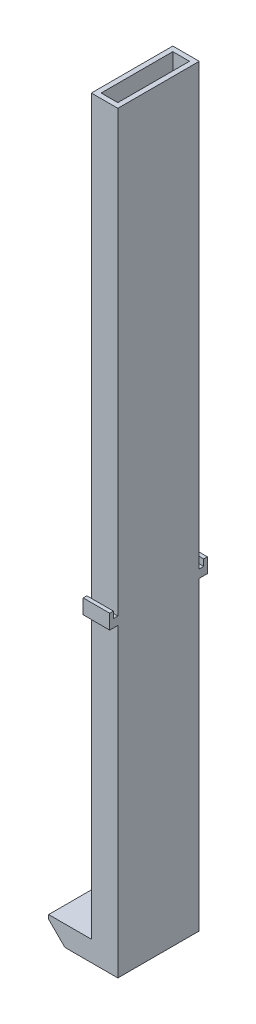
ISO-10303-21;
HEADER;
FILE_DESCRIPTION(('STEP AP214'),'2;1');
FILE_NAME('part.step','',(''),(''),'','','');
FILE_SCHEMA(('AUTOMOTIVE_DESIGN { 1 0 10303 214 1 1 1 1 }'));
ENDSEC;
DATA;
#1=APPLICATION_CONTEXT('core data for automotive mechanical design processes');
#2=APPLICATION_PROTOCOL_DEFINITION('international standard','automotive_design',2000,#1);
#3=PRODUCT_CONTEXT('',#1,'mechanical');
#4=PRODUCT('Part','Part','',(#3));
#5=PRODUCT_RELATED_PRODUCT_CATEGORY('part','',(#4));
#6=PRODUCT_DEFINITION_FORMATION('','',#4);
#7=PRODUCT_DEFINITION_CONTEXT('part definition',#1,'design');
#8=PRODUCT_DEFINITION('design','',#6,#7);
#9=PRODUCT_DEFINITION_SHAPE('','',#8);
#10=(LENGTH_UNIT() NAMED_UNIT(*) SI_UNIT(.MILLI.,.METRE.));
#11=(NAMED_UNIT(*) PLANE_ANGLE_UNIT() SI_UNIT($,.RADIAN.));
#12=(NAMED_UNIT(*) SI_UNIT($,.STERADIAN.) SOLID_ANGLE_UNIT());
#13=UNCERTAINTY_MEASURE_WITH_UNIT(LENGTH_MEASURE(1.E-05),#10,'distance_accuracy_value','');
#14=(GEOMETRIC_REPRESENTATION_CONTEXT(3) GLOBAL_UNCERTAINTY_ASSIGNED_CONTEXT((#13)) GLOBAL_UNIT_ASSIGNED_CONTEXT((#10,
#11,#12)) REPRESENTATION_CONTEXT('',''));
#15=CARTESIAN_POINT('',(0.,0.,0.));
#16=DIRECTION('',(0.,0.,1.));
#17=DIRECTION('',(1.,0.,0.));
#18=AXIS2_PLACEMENT_3D('',#15,#16,#17);
#19=CARTESIAN_POINT('',(0.,0.,0.));
#20=DIRECTION('',(0.,0.,-1.));
#21=DIRECTION('',(-1.,0.,0.));
#22=AXIS2_PLACEMENT_3D('',#19,#20,#21);
#23=PLANE('',#22);
#24=DIRECTION('',(0.,1.,0.));
#25=VECTOR('',#24,1.);
#26=CARTESIAN_POINT('',(4.25,-46.25,0.));
#27=LINE('',#26,#25);
#28=CARTESIAN_POINT('',(4.25000000000001,-7.74999999999999,0.));
#29=VERTEX_POINT('',#28);
#30=CARTESIAN_POINT('',(4.25,46.25,0.));
#31=VERTEX_POINT('',#30);
#32=EDGE_CURVE('E409',#29,#31,#27,.T.);
#33=ORIENTED_EDGE('',*,*,#32,.F.);
#34=DIRECTION('',(-1.,0.,0.));
#35=VECTOR('',#34,1.);
#36=CARTESIAN_POINT('',(4.25000000000001,-7.74999999999999,0.));
#37=LINE('',#36,#35);
#38=CARTESIAN_POINT('',(1.00000000000001,-7.74999999999999,0.));
#39=VERTEX_POINT('',#38);
#40=EDGE_CURVE('E271',#29,#39,#37,.T.);
#41=ORIENTED_EDGE('',*,*,#40,.T.);
#42=DIRECTION('',(0.,1.,0.));
#43=VECTOR('',#42,1.);
#44=CARTESIAN_POINT('',(1.00000000000001,0.,0.));
#45=LINE('',#44,#43);
#46=CARTESIAN_POINT('',(1.,46.25,0.));
#47=VERTEX_POINT('',#46);
#48=EDGE_CURVE('E427',#39,#47,#45,.T.);
#49=ORIENTED_EDGE('',*,*,#48,.T.);
#50=DIRECTION('',(1.,0.,0.));
#51=VECTOR('',#50,1.);
#52=CARTESIAN_POINT('',(-4.25,46.25,0.));
#53=LINE('',#52,#51);
#54=EDGE_CURVE('E405',#47,#31,#53,.T.);
#55=ORIENTED_EDGE('',*,*,#54,.T.);
#56=EDGE_LOOP('',(#33,#41,#49,#55));
#57=FACE_BOUND('',#56,.T.);
#58=ADVANCED_FACE('F47',(#57),#23,.T.);
#59=CARTESIAN_POINT('',(0.,0.,10.));
#60=DIRECTION('',(0.,0.,-1.));
#61=DIRECTION('',(-1.,0.,0.));
#62=AXIS2_PLACEMENT_3D('',#59,#60,#61);
#63=PLANE('',#62);
#64=DIRECTION('',(-1.,0.,0.));
#65=VECTOR('',#64,1.);
#66=CARTESIAN_POINT('',(4.25000000000001,-7.74999999999999,10.));
#67=LINE('',#66,#65);
#68=CARTESIAN_POINT('',(4.25000000000001,-7.74999999999999,10.));
#69=VERTEX_POINT('',#68);
#70=CARTESIAN_POINT('',(1.00000000000001,-7.74999999999999,10.));
#71=VERTEX_POINT('',#70);
#72=EDGE_CURVE('E346',#69,#71,#67,.T.);
#73=ORIENTED_EDGE('',*,*,#72,.F.);
#74=DIRECTION('',(0.,1.,0.));
#75=VECTOR('',#74,1.);
#76=CARTESIAN_POINT('',(4.25,-46.25,10.));
#77=LINE('',#76,#75);
#78=CARTESIAN_POINT('',(4.25,46.25,10.));
#79=VERTEX_POINT('',#78);
#80=EDGE_CURVE('E394',#69,#79,#77,.T.);
#81=ORIENTED_EDGE('',*,*,#80,.T.);
#82=DIRECTION('',(1.,0.,0.));
#83=VECTOR('',#82,1.);
#84=CARTESIAN_POINT('',(-4.25,46.25,10.));
#85=LINE('',#84,#83);
#86=CARTESIAN_POINT('',(1.,46.25,10.));
#87=VERTEX_POINT('',#86);
#88=EDGE_CURVE('E389',#87,#79,#85,.T.);
#89=ORIENTED_EDGE('',*,*,#88,.F.);
#90=DIRECTION('',(0.,-1.,0.));
#91=VECTOR('',#90,1.);
#92=CARTESIAN_POINT('',(1.,46.25,10.));
#93=LINE('',#92,#91);
#94=EDGE_CURVE('E369',#87,#71,#93,.T.);
#95=ORIENTED_EDGE('',*,*,#94,.T.);
#96=EDGE_LOOP('',(#73,#81,#89,#95));
#97=FACE_BOUND('',#96,.T.);
#98=ADVANCED_FACE('F505',(#97),#63,.F.);
#99=CARTESIAN_POINT('',(-4.25,46.25,10.));
#100=DIRECTION('',(0.,1.,0.));
#101=DIRECTION('',(0.,0.,1.));
#102=AXIS2_PLACEMENT_3D('',#99,#100,#101);
#103=PLANE('',#102);
#104=DIRECTION('',(0.,0.,-1.));
#105=VECTOR('',#104,1.);
#106=CARTESIAN_POINT('',(3.65,46.25,9.4));
#107=LINE('',#106,#105);
#108=CARTESIAN_POINT('',(3.65,46.25,9.4));
#109=VERTEX_POINT('',#108);
#110=CARTESIAN_POINT('',(3.65,46.25,0.599999999999998));
#111=VERTEX_POINT('',#110);
#112=EDGE_CURVE('E64',#109,#111,#107,.T.);
#113=ORIENTED_EDGE('',*,*,#112,.F.);
#114=DIRECTION('',(1.,0.,0.));
#115=VECTOR('',#114,1.);
#116=CARTESIAN_POINT('',(1.60000000000001,46.25,9.4));
#117=LINE('',#116,#115);
#118=CARTESIAN_POINT('',(1.60000000000001,46.25,9.4));
#119=VERTEX_POINT('',#118);
#120=EDGE_CURVE('E228',#119,#109,#117,.T.);
#121=ORIENTED_EDGE('',*,*,#120,.F.);
#122=DIRECTION('',(0.,0.,1.));
#123=VECTOR('',#122,1.);
#124=CARTESIAN_POINT('',(1.60000000000001,46.25,9.4));
#125=LINE('',#124,#123);
#126=CARTESIAN_POINT('',(1.60000000000001,46.25,0.599999999999998));
#127=VERTEX_POINT('',#126);
#128=EDGE_CURVE('E232',#127,#119,#125,.T.);
#129=ORIENTED_EDGE('',*,*,#128,.F.);
#130=DIRECTION('',(-1.,0.,0.));
#131=VECTOR('',#130,1.);
#132=CARTESIAN_POINT('',(1.60000000000001,46.25,0.599999999999998));
#133=LINE('',#132,#131);
#134=EDGE_CURVE('E241',#111,#127,#133,.T.);
#135=ORIENTED_EDGE('',*,*,#134,.F.);
#136=EDGE_LOOP('',(#113,#121,#129,#135));
#137=FACE_BOUND('',#136,.T.);
#138=ORIENTED_EDGE('',*,*,#54,.F.);
#139=DIRECTION('',(0.,0.,1.));
#140=VECTOR('',#139,1.);
#141=CARTESIAN_POINT('',(1.,46.25,-70.));
#142=LINE('',#141,#140);
#143=EDGE_CURVE('E374',#47,#87,#142,.T.);
#144=ORIENTED_EDGE('',*,*,#143,.T.);
#145=ORIENTED_EDGE('',*,*,#88,.T.);
#146=DIRECTION('',(0.,0.,-1.));
#147=VECTOR('',#146,1.);
#148=CARTESIAN_POINT('',(4.25,46.25,10.));
#149=LINE('',#148,#147);
#150=EDGE_CURVE('E402',#79,#31,#149,.T.);
#151=ORIENTED_EDGE('',*,*,#150,.T.);
#152=EDGE_LOOP('',(#138,#144,#145,#151));
#153=FACE_BOUND('',#152,.T.);
#154=ADVANCED_FACE('F482',(#137,#153),#103,.T.);
#155=CARTESIAN_POINT('',(4.25,-46.25,10.));
#156=VERTEX_POINT('',#155);
#157=CARTESIAN_POINT('',(4.25000000000001,-8.74999999999999,10.));
#158=VERTEX_POINT('',#157);
#159=EDGE_CURVE('E395',#156,#158,#77,.T.);
#160=ORIENTED_EDGE('',*,*,#159,.T.);
#161=DIRECTION('',(-1.,0.,0.));
#162=VECTOR('',#161,1.);
#163=CARTESIAN_POINT('',(4.25000000000001,-8.74999999999999,10.));
#164=LINE('',#163,#162);
#165=CARTESIAN_POINT('',(1.00000000000001,-8.74999999999998,10.));
#166=VERTEX_POINT('',#165);
#167=EDGE_CURVE('E327',#158,#166,#164,.T.);
#168=ORIENTED_EDGE('',*,*,#167,.T.);
#169=CARTESIAN_POINT('',(1.00000000000001,-43.75,10.));
#170=VERTEX_POINT('',#169);
#171=EDGE_CURVE('E368',#166,#170,#93,.T.);
#172=ORIENTED_EDGE('',*,*,#171,.T.);
#173=DIRECTION('',(1.,0.,0.));
#174=VECTOR('',#173,1.);
#175=CARTESIAN_POINT('',(-4.24999999999999,-43.75,10.));
#176=LINE('',#175,#174);
#177=CARTESIAN_POINT('',(-4.24999999999999,-43.75,10.));
#178=VERTEX_POINT('',#177);
#179=EDGE_CURVE('E349',#178,#170,#176,.T.);
#180=ORIENTED_EDGE('',*,*,#179,.F.);
#181=DIRECTION('',(0.,1.,0.));
#182=VECTOR('',#181,1.);
#183=CARTESIAN_POINT('',(-4.25,-46.25,10.));
#184=LINE('',#183,#182);
#185=CARTESIAN_POINT('',(-4.25,-44.25,10.));
#186=VERTEX_POINT('',#185);
#187=EDGE_CURVE('E386',#186,#178,#184,.T.);
#188=ORIENTED_EDGE('',*,*,#187,.F.);
#189=DIRECTION('',(0.707106781186545,-0.70710678118655,0.));
#190=VECTOR('',#189,1.);
#191=CARTESIAN_POINT('',(-2.24999999999998,-46.25,10.));
#192=LINE('',#191,#190);
#193=CARTESIAN_POINT('',(-2.24999999999998,-46.25,10.));
#194=VERTEX_POINT('',#193);
#195=EDGE_CURVE('E11',#186,#194,#192,.T.);
#196=ORIENTED_EDGE('',*,*,#195,.T.);
#197=DIRECTION('',(1.,0.,0.));
#198=VECTOR('',#197,1.);
#199=CARTESIAN_POINT('',(-4.25,-46.25,10.));
#200=LINE('',#199,#198);
#201=EDGE_CURVE('E399',#194,#156,#200,.T.);
#202=ORIENTED_EDGE('',*,*,#201,.T.);
#203=EDGE_LOOP('',(#160,#168,#172,#180,#188,#196,#202));
#204=FACE_BOUND('',#203,.T.);
#205=ADVANCED_FACE('F449',(#204),#63,.F.);
#206=DIRECTION('',(-1.,0.,0.));
#207=VECTOR('',#206,1.);
#208=CARTESIAN_POINT('',(4.25000000000001,-8.74999999999999,0.));
#209=LINE('',#208,#207);
#210=CARTESIAN_POINT('',(4.25000000000001,-8.74999999999999,0.));
#211=VERTEX_POINT('',#210);
#212=CARTESIAN_POINT('',(1.00000000000001,-8.74999999999999,0.));
#213=VERTEX_POINT('',#212);
#214=EDGE_CURVE('E285',#211,#213,#209,.T.);
#215=ORIENTED_EDGE('',*,*,#214,.F.);
#216=CARTESIAN_POINT('',(4.25,-46.25,0.));
#217=VERTEX_POINT('',#216);
#218=EDGE_CURVE('E410',#217,#211,#27,.T.);
#219=ORIENTED_EDGE('',*,*,#218,.F.);
#220=DIRECTION('',(1.,0.,0.));
#221=VECTOR('',#220,1.);
#222=CARTESIAN_POINT('',(-4.25,-46.25,0.));
#223=LINE('',#222,#221);
#224=CARTESIAN_POINT('',(-2.24999999999998,-46.25,0.));
#225=VERTEX_POINT('',#224);
#226=EDGE_CURVE('E390',#225,#217,#223,.T.);
#227=ORIENTED_EDGE('',*,*,#226,.F.);
#228=DIRECTION('',(-0.707106781186545,0.70710678118655,0.));
#229=VECTOR('',#228,1.);
#230=CARTESIAN_POINT('',(-24.25,-24.2499999999998,0.));
#231=LINE('',#230,#229);
#232=CARTESIAN_POINT('',(-4.25,-44.25,0.));
#233=VERTEX_POINT('',#232);
#234=EDGE_CURVE('E436',#225,#233,#231,.T.);
#235=ORIENTED_EDGE('',*,*,#234,.T.);
#236=DIRECTION('',(0.,1.,0.));
#237=VECTOR('',#236,1.);
#238=CARTESIAN_POINT('',(-4.25,-46.25,0.));
#239=LINE('',#238,#237);
#240=CARTESIAN_POINT('',(-4.24999999999999,-43.75,0.));
#241=VERTEX_POINT('',#240);
#242=EDGE_CURVE('E378',#233,#241,#239,.T.);
#243=ORIENTED_EDGE('',*,*,#242,.T.);
#244=DIRECTION('',(-1.,0.,0.));
#245=VECTOR('',#244,1.);
#246=CARTESIAN_POINT('',(0.,-43.75,0.));
#247=LINE('',#246,#245);
#248=CARTESIAN_POINT('',(1.00000000000001,-43.75,0.));
#249=VERTEX_POINT('',#248);
#250=EDGE_CURVE('E420',#249,#241,#247,.T.);
#251=ORIENTED_EDGE('',*,*,#250,.F.);
#252=EDGE_CURVE('E428',#249,#213,#45,.T.);
#253=ORIENTED_EDGE('',*,*,#252,.T.);
#254=EDGE_LOOP('',(#215,#219,#227,#235,#243,#251,#253));
#255=FACE_BOUND('',#254,.T.);
#256=ADVANCED_FACE('F459',(#255),#23,.T.);
#257=CARTESIAN_POINT('',(-4.25,-46.25,10.));
#258=DIRECTION('',(-1.,0.,0.));
#259=DIRECTION('',(0.,0.,1.));
#260=AXIS2_PLACEMENT_3D('',#257,#258,#259);
#261=PLANE('',#260);
#262=ORIENTED_EDGE('',*,*,#242,.F.);
#263=DIRECTION('',(0.,0.,1.));
#264=VECTOR('',#263,1.);
#265=CARTESIAN_POINT('',(-4.25,-44.25,10.));
#266=LINE('',#265,#264);
#267=EDGE_CURVE('E57',#233,#186,#266,.T.);
#268=ORIENTED_EDGE('',*,*,#267,.T.);
#269=ORIENTED_EDGE('',*,*,#187,.T.);
#270=DIRECTION('',(0.,0.,1.));
#271=VECTOR('',#270,1.);
#272=CARTESIAN_POINT('',(-4.24999999999999,-43.75,-70.));
#273=LINE('',#272,#271);
#274=EDGE_CURVE('E373',#241,#178,#273,.T.);
#275=ORIENTED_EDGE('',*,*,#274,.F.);
#276=EDGE_LOOP('',(#262,#268,#269,#275));
#277=FACE_BOUND('',#276,.T.);
#278=ADVANCED_FACE('F443',(#277),#261,.T.);
#279=CARTESIAN_POINT('',(-4.25,-46.25,10.));
#280=DIRECTION('',(0.,1.,0.));
#281=DIRECTION('',(0.,0.,1.));
#282=AXIS2_PLACEMENT_3D('',#279,#280,#281);
#283=PLANE('',#282);
#284=ORIENTED_EDGE('',*,*,#201,.F.);
#285=DIRECTION('',(0.,0.,-1.));
#286=VECTOR('',#285,1.);
#287=CARTESIAN_POINT('',(-2.24999999999998,-46.25,0.));
#288=LINE('',#287,#286);
#289=EDGE_CURVE('E432',#194,#225,#288,.T.);
#290=ORIENTED_EDGE('',*,*,#289,.T.);
#291=ORIENTED_EDGE('',*,*,#226,.T.);
#292=DIRECTION('',(0.,0.,-1.));
#293=VECTOR('',#292,1.);
#294=CARTESIAN_POINT('',(4.25,-46.25,10.));
#295=LINE('',#294,#293);
#296=EDGE_CURVE('E416',#156,#217,#295,.T.);
#297=ORIENTED_EDGE('',*,*,#296,.F.);
#298=EDGE_LOOP('',(#284,#290,#291,#297));
#299=FACE_BOUND('',#298,.T.);
#300=ADVANCED_FACE('F454',(#299),#283,.F.);
#301=CARTESIAN_POINT('',(4.25,-46.25,10.));
#302=DIRECTION('',(-1.,0.,0.));
#303=DIRECTION('',(0.,0.,1.));
#304=AXIS2_PLACEMENT_3D('',#301,#302,#303);
#305=PLANE('',#304);
#306=ORIENTED_EDGE('',*,*,#218,.T.);
#307=DIRECTION('',(0.,0.,-1.));
#308=VECTOR('',#307,1.);
#309=CARTESIAN_POINT('',(4.25000000000001,-8.74999999999999,0.));
#310=LINE('',#309,#308);
#311=CARTESIAN_POINT('',(4.25000000000001,-8.74999999999999,-1.00000000000001));
#312=VERTEX_POINT('',#311);
#313=EDGE_CURVE('E268',#211,#312,#310,.T.);
#314=ORIENTED_EDGE('',*,*,#313,.T.);
#315=DIRECTION('',(0.,1.,0.));
#316=VECTOR('',#315,1.);
#317=CARTESIAN_POINT('',(4.25000000000001,-8.74999999999999,-1.00000000000001));
#318=LINE('',#317,#316);
#319=CARTESIAN_POINT('',(4.25000000000001,-6.94999999999999,-1.00000000000001));
#320=VERTEX_POINT('',#319);
#321=EDGE_CURVE('E265',#312,#320,#318,.T.);
#322=ORIENTED_EDGE('',*,*,#321,.T.);
#323=DIRECTION('',(0.,0.,1.));
#324=VECTOR('',#323,1.);
#325=CARTESIAN_POINT('',(4.25000000000001,-6.94999999999999,-1.00000000000001));
#326=LINE('',#325,#324);
#327=CARTESIAN_POINT('',(4.25000000000001,-6.94999999999999,-0.550000000000005));
#328=VERTEX_POINT('',#327);
#329=EDGE_CURVE('E262',#320,#328,#326,.T.);
#330=ORIENTED_EDGE('',*,*,#329,.T.);
#331=DIRECTION('',(0.,-1.,0.));
#332=VECTOR('',#331,1.);
#333=CARTESIAN_POINT('',(4.25000000000001,-6.94999999999999,-0.550000000000005));
#334=LINE('',#333,#332);
#335=CARTESIAN_POINT('',(4.25000000000001,-7.74999999999999,-0.550000000000005));
#336=VERTEX_POINT('',#335);
#337=EDGE_CURVE('E258',#328,#336,#334,.T.);
#338=ORIENTED_EDGE('',*,*,#337,.T.);
#339=DIRECTION('',(0.,0.,1.));
#340=VECTOR('',#339,1.);
#341=CARTESIAN_POINT('',(4.25000000000001,-7.74999999999999,-0.550000000000005));
#342=LINE('',#341,#340);
#343=EDGE_CURVE('E255',#336,#29,#342,.T.);
#344=ORIENTED_EDGE('',*,*,#343,.T.);
#345=ORIENTED_EDGE('',*,*,#32,.T.);
#346=ORIENTED_EDGE('',*,*,#150,.F.);
#347=ORIENTED_EDGE('',*,*,#80,.F.);
#348=DIRECTION('',(0.,0.,-1.));
#349=VECTOR('',#348,1.);
#350=CARTESIAN_POINT('',(4.25000000000001,-7.74999999999999,10.55));
#351=LINE('',#350,#349);
#352=CARTESIAN_POINT('',(4.25000000000001,-7.74999999999999,10.55));
#353=VERTEX_POINT('',#352);
#354=EDGE_CURVE('E324',#353,#69,#351,.T.);
#355=ORIENTED_EDGE('',*,*,#354,.F.);
#356=DIRECTION('',(0.,-1.,0.));
#357=VECTOR('',#356,1.);
#358=CARTESIAN_POINT('',(4.25000000000001,-6.94999999999999,10.55));
#359=LINE('',#358,#357);
#360=CARTESIAN_POINT('',(4.25000000000001,-6.94999999999999,10.55));
#361=VERTEX_POINT('',#360);
#362=EDGE_CURVE('E320',#361,#353,#359,.T.);
#363=ORIENTED_EDGE('',*,*,#362,.F.);
#364=DIRECTION('',(0.,0.,-1.));
#365=VECTOR('',#364,1.);
#366=CARTESIAN_POINT('',(4.25000000000001,-6.94999999999999,11.));
#367=LINE('',#366,#365);
#368=CARTESIAN_POINT('',(4.25000000000001,-6.94999999999999,11.));
#369=VERTEX_POINT('',#368);
#370=EDGE_CURVE('E316',#369,#361,#367,.T.);
#371=ORIENTED_EDGE('',*,*,#370,.F.);
#372=DIRECTION('',(0.,1.,0.));
#373=VECTOR('',#372,1.);
#374=CARTESIAN_POINT('',(4.25000000000001,-8.74999999999999,11.));
#375=LINE('',#374,#373);
#376=CARTESIAN_POINT('',(4.25000000000001,-8.74999999999999,11.));
#377=VERTEX_POINT('',#376);
#378=EDGE_CURVE('E311',#377,#369,#375,.T.);
#379=ORIENTED_EDGE('',*,*,#378,.F.);
#380=DIRECTION('',(0.,0.,1.));
#381=VECTOR('',#380,1.);
#382=CARTESIAN_POINT('',(4.25000000000001,-8.74999999999999,10.));
#383=LINE('',#382,#381);
#384=EDGE_CURVE('E307',#158,#377,#383,.T.);
#385=ORIENTED_EDGE('',*,*,#384,.F.);
#386=ORIENTED_EDGE('',*,*,#159,.F.);
#387=ORIENTED_EDGE('',*,*,#296,.T.);
#388=EDGE_LOOP('',(#306,#314,#322,#330,#338,#344,#345,#346,#347,#355,#363,#371,#379,#385,#386,#387));
#389=FACE_BOUND('',#388,.T.);
#390=ADVANCED_FACE('F461',(#389),#305,.F.);
#391=CARTESIAN_POINT('',(1.,46.25,-70.));
#392=DIRECTION('',(-1.,0.,0.));
#393=DIRECTION('',(0.,-1.,0.));
#394=AXIS2_PLACEMENT_3D('',#391,#392,#393);
#395=PLANE('',#394);
#396=DIRECTION('',(0.,0.,1.));
#397=VECTOR('',#396,1.);
#398=CARTESIAN_POINT('',(1.00000000000001,-43.75,-70.));
#399=LINE('',#398,#397);
#400=EDGE_CURVE('E379',#249,#170,#399,.T.);
#401=ORIENTED_EDGE('',*,*,#400,.T.);
#402=ORIENTED_EDGE('',*,*,#171,.F.);
#403=DIRECTION('',(0.,0.,1.));
#404=VECTOR('',#403,1.);
#405=CARTESIAN_POINT('',(1.00000000000001,-8.74999999999999,10.));
#406=LINE('',#405,#404);
#407=CARTESIAN_POINT('',(1.00000000000001,-8.74999999999999,11.));
#408=VERTEX_POINT('',#407);
#409=EDGE_CURVE('E289',#166,#408,#406,.T.);
#410=ORIENTED_EDGE('',*,*,#409,.T.);
#411=DIRECTION('',(0.,1.,0.));
#412=VECTOR('',#411,1.);
#413=CARTESIAN_POINT('',(1.00000000000001,-8.74999999999999,11.));
#414=LINE('',#413,#412);
#415=CARTESIAN_POINT('',(1.00000000000001,-6.94999999999999,11.));
#416=VERTEX_POINT('',#415);
#417=EDGE_CURVE('E331',#408,#416,#414,.T.);
#418=ORIENTED_EDGE('',*,*,#417,.T.);
#419=DIRECTION('',(0.,0.,-1.));
#420=VECTOR('',#419,1.);
#421=CARTESIAN_POINT('',(1.00000000000001,-6.94999999999999,11.));
#422=LINE('',#421,#420);
#423=CARTESIAN_POINT('',(1.00000000000001,-6.94999999999999,10.55));
#424=VERTEX_POINT('',#423);
#425=EDGE_CURVE('E335',#416,#424,#422,.T.);
#426=ORIENTED_EDGE('',*,*,#425,.T.);
#427=DIRECTION('',(0.,-1.,0.));
#428=VECTOR('',#427,1.);
#429=CARTESIAN_POINT('',(1.00000000000001,-6.94999999999999,10.55));
#430=LINE('',#429,#428);
#431=CARTESIAN_POINT('',(1.00000000000001,-7.74999999999999,10.55));
#432=VERTEX_POINT('',#431);
#433=EDGE_CURVE('E339',#424,#432,#430,.T.);
#434=ORIENTED_EDGE('',*,*,#433,.T.);
#435=DIRECTION('',(0.,0.,-1.));
#436=VECTOR('',#435,1.);
#437=CARTESIAN_POINT('',(1.00000000000001,-7.74999999999999,10.55));
#438=LINE('',#437,#436);
#439=EDGE_CURVE('E312',#432,#71,#438,.T.);
#440=ORIENTED_EDGE('',*,*,#439,.T.);
#441=ORIENTED_EDGE('',*,*,#94,.F.);
#442=ORIENTED_EDGE('',*,*,#143,.F.);
#443=ORIENTED_EDGE('',*,*,#48,.F.);
#444=DIRECTION('',(0.,0.,1.));
#445=VECTOR('',#444,1.);
#446=CARTESIAN_POINT('',(1.00000000000001,-7.74999999999999,-0.550000000000005));
#447=LINE('',#446,#445);
#448=CARTESIAN_POINT('',(1.00000000000001,-7.74999999999999,-0.550000000000005));
#449=VERTEX_POINT('',#448);
#450=EDGE_CURVE('E72',#449,#39,#447,.T.);
#451=ORIENTED_EDGE('',*,*,#450,.F.);
#452=DIRECTION('',(0.,-1.,0.));
#453=VECTOR('',#452,1.);
#454=CARTESIAN_POINT('',(1.00000000000001,-6.94999999999999,-0.550000000000005));
#455=LINE('',#454,#453);
#456=CARTESIAN_POINT('',(1.00000000000001,-6.94999999999999,-0.550000000000005));
#457=VERTEX_POINT('',#456);
#458=EDGE_CURVE('E274',#457,#449,#455,.T.);
#459=ORIENTED_EDGE('',*,*,#458,.F.);
#460=DIRECTION('',(0.,0.,1.));
#461=VECTOR('',#460,1.);
#462=CARTESIAN_POINT('',(1.00000000000001,-6.94999999999999,-1.00000000000001));
#463=LINE('',#462,#461);
#464=CARTESIAN_POINT('',(1.00000000000001,-6.94999999999999,-1.00000000000001));
#465=VERTEX_POINT('',#464);
#466=EDGE_CURVE('E277',#465,#457,#463,.T.);
#467=ORIENTED_EDGE('',*,*,#466,.F.);
#468=DIRECTION('',(0.,1.,0.));
#469=VECTOR('',#468,1.);
#470=CARTESIAN_POINT('',(1.00000000000001,-8.74999999999999,-1.00000000000001));
#471=LINE('',#470,#469);
#472=CARTESIAN_POINT('',(1.00000000000001,-8.74999999999999,-1.00000000000001));
#473=VERTEX_POINT('',#472);
#474=EDGE_CURVE('E280',#473,#465,#471,.T.);
#475=ORIENTED_EDGE('',*,*,#474,.F.);
#476=DIRECTION('',(0.,0.,-1.));
#477=VECTOR('',#476,1.);
#478=CARTESIAN_POINT('',(1.00000000000001,-8.74999999999999,0.));
#479=LINE('',#478,#477);
#480=EDGE_CURVE('E259',#213,#473,#479,.T.);
#481=ORIENTED_EDGE('',*,*,#480,.F.);
#482=ORIENTED_EDGE('',*,*,#252,.F.);
#483=EDGE_LOOP('',(#401,#402,#410,#418,#426,#434,#440,#441,#442,#443,#451,#459,#467,#475,#481,#482));
#484=FACE_BOUND('',#483,.T.);
#485=ADVANCED_FACE('F469',(#484),#395,.T.);
#486=CARTESIAN_POINT('',(-4.24999999999999,-43.75,-70.));
#487=DIRECTION('',(0.,-1.,0.));
#488=DIRECTION('',(0.,0.,-1.));
#489=AXIS2_PLACEMENT_3D('',#486,#487,#488);
#490=PLANE('',#489);
#491=ORIENTED_EDGE('',*,*,#250,.T.);
#492=ORIENTED_EDGE('',*,*,#274,.T.);
#493=ORIENTED_EDGE('',*,*,#179,.T.);
#494=ORIENTED_EDGE('',*,*,#400,.F.);
#495=EDGE_LOOP('',(#491,#492,#493,#494));
#496=FACE_BOUND('',#495,.T.);
#497=ADVANCED_FACE('F526',(#496),#490,.F.);
#498=CARTESIAN_POINT('',(-2.24999999999998,-46.25,10.));
#499=DIRECTION('',(-0.70710678118655,-0.707106781186545,0.));
#500=DIRECTION('',(0.,0.,1.));
#501=AXIS2_PLACEMENT_3D('',#498,#499,#500);
#502=PLANE('',#501);
#503=ORIENTED_EDGE('',*,*,#195,.F.);
#504=ORIENTED_EDGE('',*,*,#267,.F.);
#505=ORIENTED_EDGE('',*,*,#234,.F.);
#506=ORIENTED_EDGE('',*,*,#289,.F.);
#507=EDGE_LOOP('',(#503,#504,#505,#506));
#508=FACE_BOUND('',#507,.T.);
#509=ADVANCED_FACE('F50',(#508),#502,.T.);
#510=CARTESIAN_POINT('',(4.25000000000001,-7.74999999999999,10.55));
#511=DIRECTION('',(0.,1.,0.));
#512=DIRECTION('',(0.,0.,1.));
#513=AXIS2_PLACEMENT_3D('',#510,#511,#512);
#514=PLANE('',#513);
#515=ORIENTED_EDGE('',*,*,#439,.F.);
#516=DIRECTION('',(-1.,0.,0.));
#517=VECTOR('',#516,1.);
#518=CARTESIAN_POINT('',(4.25000000000001,-7.74999999999999,10.55));
#519=LINE('',#518,#517);
#520=EDGE_CURVE('E350',#353,#432,#519,.T.);
#521=ORIENTED_EDGE('',*,*,#520,.F.);
#522=ORIENTED_EDGE('',*,*,#354,.T.);
#523=ORIENTED_EDGE('',*,*,#72,.T.);
#524=EDGE_LOOP('',(#515,#521,#522,#523));
#525=FACE_BOUND('',#524,.T.);
#526=ADVANCED_FACE('F545',(#525),#514,.T.);
#527=CARTESIAN_POINT('',(4.25000000000001,-6.94999999999999,10.55));
#528=DIRECTION('',(0.,0.,-1.));
#529=DIRECTION('',(-1.,0.,0.));
#530=AXIS2_PLACEMENT_3D('',#527,#528,#529);
#531=PLANE('',#530);
#532=ORIENTED_EDGE('',*,*,#433,.F.);
#533=DIRECTION('',(-1.,0.,0.));
#534=VECTOR('',#533,1.);
#535=CARTESIAN_POINT('',(4.25000000000001,-6.94999999999999,10.55));
#536=LINE('',#535,#534);
#537=EDGE_CURVE('E353',#361,#424,#536,.T.);
#538=ORIENTED_EDGE('',*,*,#537,.F.);
#539=ORIENTED_EDGE('',*,*,#362,.T.);
#540=ORIENTED_EDGE('',*,*,#520,.T.);
#541=EDGE_LOOP('',(#532,#538,#539,#540));
#542=FACE_BOUND('',#541,.T.);
#543=ADVANCED_FACE('F542',(#542),#531,.T.);
#544=CARTESIAN_POINT('',(4.25000000000001,-6.94999999999999,11.));
#545=DIRECTION('',(0.,1.,0.));
#546=DIRECTION('',(-1.,0.,0.));
#547=AXIS2_PLACEMENT_3D('',#544,#545,#546);
#548=PLANE('',#547);
#549=ORIENTED_EDGE('',*,*,#425,.F.);
#550=DIRECTION('',(-1.,0.,0.));
#551=VECTOR('',#550,1.);
#552=CARTESIAN_POINT('',(4.25000000000001,-6.94999999999999,11.));
#553=LINE('',#552,#551);
#554=EDGE_CURVE('E356',#369,#416,#553,.T.);
#555=ORIENTED_EDGE('',*,*,#554,.F.);
#556=ORIENTED_EDGE('',*,*,#370,.T.);
#557=ORIENTED_EDGE('',*,*,#537,.T.);
#558=EDGE_LOOP('',(#549,#555,#556,#557));
#559=FACE_BOUND('',#558,.T.);
#560=ADVANCED_FACE('F538',(#559),#548,.T.);
#561=CARTESIAN_POINT('',(4.25000000000001,-8.74999999999999,11.));
#562=DIRECTION('',(0.,0.,1.));
#563=DIRECTION('',(1.,0.,0.));
#564=AXIS2_PLACEMENT_3D('',#561,#562,#563);
#565=PLANE('',#564);
#566=ORIENTED_EDGE('',*,*,#417,.F.);
#567=DIRECTION('',(-1.,0.,0.));
#568=VECTOR('',#567,1.);
#569=CARTESIAN_POINT('',(4.25000000000001,-8.74999999999999,11.));
#570=LINE('',#569,#568);
#571=EDGE_CURVE('E359',#377,#408,#570,.T.);
#572=ORIENTED_EDGE('',*,*,#571,.F.);
#573=ORIENTED_EDGE('',*,*,#378,.T.);
#574=ORIENTED_EDGE('',*,*,#554,.T.);
#575=EDGE_LOOP('',(#566,#572,#573,#574));
#576=FACE_BOUND('',#575,.T.);
#577=ADVANCED_FACE('F535',(#576),#565,.T.);
#578=CARTESIAN_POINT('',(4.25000000000001,-8.74999999999999,10.));
#579=DIRECTION('',(0.,-1.,0.));
#580=DIRECTION('',(1.,0.,0.));
#581=AXIS2_PLACEMENT_3D('',#578,#579,#580);
#582=PLANE('',#581);
#583=ORIENTED_EDGE('',*,*,#409,.F.);
#584=ORIENTED_EDGE('',*,*,#167,.F.);
#585=ORIENTED_EDGE('',*,*,#384,.T.);
#586=ORIENTED_EDGE('',*,*,#571,.T.);
#587=EDGE_LOOP('',(#583,#584,#585,#586));
#588=FACE_BOUND('',#587,.T.);
#589=ADVANCED_FACE('F532',(#588),#582,.T.);
#590=CARTESIAN_POINT('',(4.25000000000001,-8.74999999999999,0.));
#591=DIRECTION('',(0.,1.,0.));
#592=DIRECTION('',(-1.,0.,0.));
#593=AXIS2_PLACEMENT_3D('',#590,#591,#592);
#594=PLANE('',#593);
#595=ORIENTED_EDGE('',*,*,#480,.T.);
#596=DIRECTION('',(-1.,0.,0.));
#597=VECTOR('',#596,1.);
#598=CARTESIAN_POINT('',(4.25000000000001,-8.74999999999999,-1.00000000000001));
#599=LINE('',#598,#597);
#600=EDGE_CURVE('E290',#312,#473,#599,.T.);
#601=ORIENTED_EDGE('',*,*,#600,.F.);
#602=ORIENTED_EDGE('',*,*,#313,.F.);
#603=ORIENTED_EDGE('',*,*,#214,.T.);
#604=EDGE_LOOP('',(#595,#601,#602,#603));
#605=FACE_BOUND('',#604,.T.);
#606=ADVANCED_FACE('F534',(#605),#594,.F.);
#607=CARTESIAN_POINT('',(4.25000000000001,-8.74999999999999,-1.00000000000001));
#608=DIRECTION('',(0.,0.,1.));
#609=DIRECTION('',(1.,0.,0.));
#610=AXIS2_PLACEMENT_3D('',#607,#608,#609);
#611=PLANE('',#610);
#612=ORIENTED_EDGE('',*,*,#474,.T.);
#613=DIRECTION('',(-1.,0.,0.));
#614=VECTOR('',#613,1.);
#615=CARTESIAN_POINT('',(4.25000000000001,-6.94999999999999,-1.00000000000001));
#616=LINE('',#615,#614);
#617=EDGE_CURVE('E294',#320,#465,#616,.T.);
#618=ORIENTED_EDGE('',*,*,#617,.F.);
#619=ORIENTED_EDGE('',*,*,#321,.F.);
#620=ORIENTED_EDGE('',*,*,#600,.T.);
#621=EDGE_LOOP('',(#612,#618,#619,#620));
#622=FACE_BOUND('',#621,.T.);
#623=ADVANCED_FACE('F611',(#622),#611,.F.);
#624=CARTESIAN_POINT('',(4.25000000000001,-6.94999999999999,-1.00000000000001));
#625=DIRECTION('',(0.,-1.,0.));
#626=DIRECTION('',(1.,0.,0.));
#627=AXIS2_PLACEMENT_3D('',#624,#625,#626);
#628=PLANE('',#627);
#629=ORIENTED_EDGE('',*,*,#466,.T.);
#630=DIRECTION('',(-1.,0.,0.));
#631=VECTOR('',#630,1.);
#632=CARTESIAN_POINT('',(4.25000000000001,-6.94999999999999,-0.550000000000005));
#633=LINE('',#632,#631);
#634=EDGE_CURVE('E298',#328,#457,#633,.T.);
#635=ORIENTED_EDGE('',*,*,#634,.F.);
#636=ORIENTED_EDGE('',*,*,#329,.F.);
#637=ORIENTED_EDGE('',*,*,#617,.T.);
#638=EDGE_LOOP('',(#629,#635,#636,#637));
#639=FACE_BOUND('',#638,.T.);
#640=ADVANCED_FACE('F500',(#639),#628,.F.);
#641=CARTESIAN_POINT('',(4.25000000000001,-6.94999999999999,-0.550000000000005));
#642=DIRECTION('',(0.,0.,-1.));
#643=DIRECTION('',(-1.,0.,0.));
#644=AXIS2_PLACEMENT_3D('',#641,#642,#643);
#645=PLANE('',#644);
#646=ORIENTED_EDGE('',*,*,#458,.T.);
#647=DIRECTION('',(-1.,0.,0.));
#648=VECTOR('',#647,1.);
#649=CARTESIAN_POINT('',(4.25000000000001,-7.74999999999999,-0.550000000000005));
#650=LINE('',#649,#648);
#651=EDGE_CURVE('E302',#336,#449,#650,.T.);
#652=ORIENTED_EDGE('',*,*,#651,.F.);
#653=ORIENTED_EDGE('',*,*,#337,.F.);
#654=ORIENTED_EDGE('',*,*,#634,.T.);
#655=EDGE_LOOP('',(#646,#652,#653,#654));
#656=FACE_BOUND('',#655,.T.);
#657=ADVANCED_FACE('F491',(#656),#645,.F.);
#658=CARTESIAN_POINT('',(4.25000000000001,-7.74999999999999,-0.550000000000005));
#659=DIRECTION('',(0.,-1.,0.));
#660=DIRECTION('',(0.,0.,-1.));
#661=AXIS2_PLACEMENT_3D('',#658,#659,#660);
#662=PLANE('',#661);
#663=ORIENTED_EDGE('',*,*,#450,.T.);
#664=ORIENTED_EDGE('',*,*,#40,.F.);
#665=ORIENTED_EDGE('',*,*,#343,.F.);
#666=ORIENTED_EDGE('',*,*,#651,.T.);
#667=EDGE_LOOP('',(#663,#664,#665,#666));
#668=FACE_BOUND('',#667,.T.);
#669=ADVANCED_FACE('F489',(#668),#662,.F.);
#670=CARTESIAN_POINT('',(3.65,-33.75,9.4));
#671=DIRECTION('',(1.,0.,0.));
#672=DIRECTION('',(0.,0.,-1.));
#673=AXIS2_PLACEMENT_3D('',#670,#671,#672);
#674=PLANE('',#673);
#675=ORIENTED_EDGE('',*,*,#112,.T.);
#676=DIRECTION('',(0.,1.,0.));
#677=VECTOR('',#676,1.);
#678=CARTESIAN_POINT('',(3.65,-33.75,0.599999999999998));
#679=LINE('',#678,#677);
#680=CARTESIAN_POINT('',(3.65,-33.75,0.599999999999998));
#681=VERTEX_POINT('',#680);
#682=EDGE_CURVE('E203',#681,#111,#679,.T.);
#683=ORIENTED_EDGE('',*,*,#682,.F.);
#684=DIRECTION('',(0.,0.,-1.));
#685=VECTOR('',#684,1.);
#686=CARTESIAN_POINT('',(3.65,-33.75,9.4));
#687=LINE('',#686,#685);
#688=CARTESIAN_POINT('',(3.65,-33.75,9.4));
#689=VERTEX_POINT('',#688);
#690=EDGE_CURVE('E207',#689,#681,#687,.T.);
#691=ORIENTED_EDGE('',*,*,#690,.F.);
#692=DIRECTION('',(0.,1.,0.));
#693=VECTOR('',#692,1.);
#694=CARTESIAN_POINT('',(3.65,-33.75,9.4));
#695=LINE('',#694,#693);
#696=EDGE_CURVE('E247',#689,#109,#695,.T.);
#697=ORIENTED_EDGE('',*,*,#696,.T.);
#698=EDGE_LOOP('',(#675,#683,#691,#697));
#699=FACE_BOUND('',#698,.T.);
#700=ADVANCED_FACE('F205',(#699),#674,.F.);
#701=CARTESIAN_POINT('',(1.60000000000001,-33.75,9.4));
#702=DIRECTION('',(0.,0.,1.));
#703=DIRECTION('',(1.,0.,0.));
#704=AXIS2_PLACEMENT_3D('',#701,#702,#703);
#705=PLANE('',#704);
#706=ORIENTED_EDGE('',*,*,#120,.T.);
#707=ORIENTED_EDGE('',*,*,#696,.F.);
#708=DIRECTION('',(1.,0.,0.));
#709=VECTOR('',#708,1.);
#710=CARTESIAN_POINT('',(1.60000000000001,-33.75,9.4));
#711=LINE('',#710,#709);
#712=CARTESIAN_POINT('',(1.60000000000001,-33.75,9.4));
#713=VERTEX_POINT('',#712);
#714=EDGE_CURVE('E214',#713,#689,#711,.T.);
#715=ORIENTED_EDGE('',*,*,#714,.F.);
#716=DIRECTION('',(0.,1.,0.));
#717=VECTOR('',#716,1.);
#718=CARTESIAN_POINT('',(1.60000000000001,-33.75,9.4));
#719=LINE('',#718,#717);
#720=EDGE_CURVE('E250',#713,#119,#719,.T.);
#721=ORIENTED_EDGE('',*,*,#720,.T.);
#722=EDGE_LOOP('',(#706,#707,#715,#721));
#723=FACE_BOUND('',#722,.T.);
#724=ADVANCED_FACE('F498',(#723),#705,.F.);
#725=CARTESIAN_POINT('',(1.60000000000001,-33.75,9.4));
#726=DIRECTION('',(-1.,0.,0.));
#727=DIRECTION('',(0.,0.,1.));
#728=AXIS2_PLACEMENT_3D('',#725,#726,#727);
#729=PLANE('',#728);
#730=ORIENTED_EDGE('',*,*,#128,.T.);
#731=ORIENTED_EDGE('',*,*,#720,.F.);
#732=DIRECTION('',(0.,0.,1.));
#733=VECTOR('',#732,1.);
#734=CARTESIAN_POINT('',(1.60000000000001,-33.75,9.4));
#735=LINE('',#734,#733);
#736=CARTESIAN_POINT('',(1.60000000000001,-33.75,0.599999999999998));
#737=VERTEX_POINT('',#736);
#738=EDGE_CURVE('E223',#737,#713,#735,.T.);
#739=ORIENTED_EDGE('',*,*,#738,.F.);
#740=DIRECTION('',(0.,1.,0.));
#741=VECTOR('',#740,1.);
#742=CARTESIAN_POINT('',(1.60000000000001,-33.75,0.599999999999998));
#743=LINE('',#742,#741);
#744=EDGE_CURVE('E213',#737,#127,#743,.T.);
#745=ORIENTED_EDGE('',*,*,#744,.T.);
#746=EDGE_LOOP('',(#730,#731,#739,#745));
#747=FACE_BOUND('',#746,.T.);
#748=ADVANCED_FACE('F651',(#747),#729,.F.);
#749=CARTESIAN_POINT('',(1.60000000000001,-33.75,0.599999999999998));
#750=DIRECTION('',(0.,0.,-1.));
#751=DIRECTION('',(-1.,0.,0.));
#752=AXIS2_PLACEMENT_3D('',#749,#750,#751);
#753=PLANE('',#752);
#754=ORIENTED_EDGE('',*,*,#134,.T.);
#755=ORIENTED_EDGE('',*,*,#744,.F.);
#756=DIRECTION('',(-1.,0.,0.));
#757=VECTOR('',#756,1.);
#758=CARTESIAN_POINT('',(1.60000000000001,-33.75,0.599999999999998));
#759=LINE('',#758,#757);
#760=EDGE_CURVE('E217',#681,#737,#759,.T.);
#761=ORIENTED_EDGE('',*,*,#760,.F.);
#762=ORIENTED_EDGE('',*,*,#682,.T.);
#763=EDGE_LOOP('',(#754,#755,#761,#762));
#764=FACE_BOUND('',#763,.T.);
#765=ADVANCED_FACE('F218',(#764),#753,.F.);
#766=CARTESIAN_POINT('',(0.,-33.75,0.));
#767=DIRECTION('',(0.,-1.,0.));
#768=DIRECTION('',(0.,0.,-1.));
#769=AXIS2_PLACEMENT_3D('',#766,#767,#768);
#770=PLANE('',#769);
#771=ORIENTED_EDGE('',*,*,#690,.T.);
#772=ORIENTED_EDGE('',*,*,#760,.T.);
#773=ORIENTED_EDGE('',*,*,#738,.T.);
#774=ORIENTED_EDGE('',*,*,#714,.T.);
#775=EDGE_LOOP('',(#771,#772,#773,#774));
#776=FACE_BOUND('',#775,.T.);
#777=ADVANCED_FACE('F225',(#776),#770,.F.);
#778=CLOSED_SHELL('',(#58,#98,#154,#205,#256,#278,#300,#390,#485,#497,#509,#526,#543,#560,#577,
#589,#606,#623,#640,#657,#669,#700,#724,#748,#765,#777));
#779=MANIFOLD_SOLID_BREP('B2',#778);
#780=ADVANCED_BREP_SHAPE_REPRESENTATION('',(#18,#779),#14);
#781=SHAPE_DEFINITION_REPRESENTATION(#9,#780);
ENDSEC;
END-ISO-10303-21;
